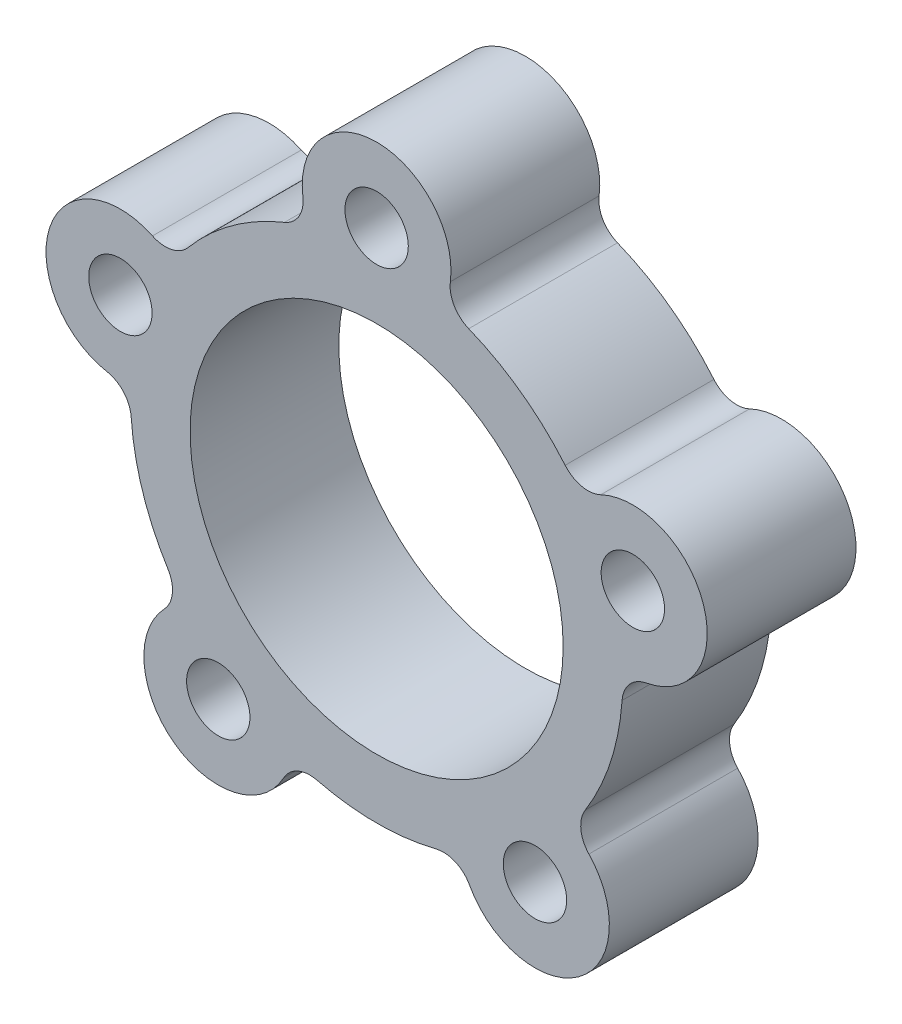
ISO-10303-21;
HEADER;
FILE_DESCRIPTION(('STEP AP214'),'2;1');
FILE_NAME('part.step','',(''),(''),'','','');
FILE_SCHEMA(('AUTOMOTIVE_DESIGN { 1 0 10303 214 1 1 1 1 }'));
ENDSEC;
DATA;
#1=APPLICATION_CONTEXT('core data for automotive mechanical design processes');
#2=APPLICATION_PROTOCOL_DEFINITION('international standard','automotive_design',2000,#1);
#3=PRODUCT_CONTEXT('',#1,'mechanical');
#4=PRODUCT('Part','Part','',(#3));
#5=PRODUCT_RELATED_PRODUCT_CATEGORY('part','',(#4));
#6=PRODUCT_DEFINITION_FORMATION('','',#4);
#7=PRODUCT_DEFINITION_CONTEXT('part definition',#1,'design');
#8=PRODUCT_DEFINITION('design','',#6,#7);
#9=PRODUCT_DEFINITION_SHAPE('','',#8);
#10=(LENGTH_UNIT() NAMED_UNIT(*) SI_UNIT(.MILLI.,.METRE.));
#11=(NAMED_UNIT(*) PLANE_ANGLE_UNIT() SI_UNIT($,.RADIAN.));
#12=(NAMED_UNIT(*) SI_UNIT($,.STERADIAN.) SOLID_ANGLE_UNIT());
#13=UNCERTAINTY_MEASURE_WITH_UNIT(LENGTH_MEASURE(1.E-05),#10,'distance_accuracy_value','');
#14=(GEOMETRIC_REPRESENTATION_CONTEXT(3) GLOBAL_UNCERTAINTY_ASSIGNED_CONTEXT((#13)) GLOBAL_UNIT_ASSIGNED_CONTEXT((#10,
#11,#12)) REPRESENTATION_CONTEXT('',''));
#15=CARTESIAN_POINT('',(0.,0.,0.));
#16=DIRECTION('',(0.,0.,1.));
#17=DIRECTION('',(1.,0.,0.));
#18=AXIS2_PLACEMENT_3D('',#15,#16,#17);
#19=CARTESIAN_POINT('',(2.20330688721567,5.45854672630436,16.51));
#20=DIRECTION('',(0.,0.,1.));
#21=DIRECTION('',(1.,0.,0.));
#22=AXIS2_PLACEMENT_3D('',#19,#20,#21);
#23=PLANE('',#22);
#24=CARTESIAN_POINT('',(-10.9371499373943,3.55369543531211,16.51));
#25=DIRECTION('',(0.,0.,1.));
#26=DIRECTION('',(1.,0.,0.));
#27=AXIS2_PLACEMENT_3D('',#24,#25,#26);
#28=CIRCLE('',#27,1.35255);
#29=CARTESIAN_POINT('',(-9.58459993739428,3.55369543531211,16.51));
#30=VERTEX_POINT('',#29);
#31=EDGE_CURVE('E414',#30,#30,#28,.T.);
#32=ORIENTED_EDGE('',*,*,#31,.F.);
#33=EDGE_LOOP('',(#32));
#34=FACE_BOUND('',#33,.T.);
#35=CARTESIAN_POINT('',(0.,11.5000000000002,16.51));
#36=DIRECTION('',(0.,0.,1.));
#37=DIRECTION('',(1.,0.,0.));
#38=AXIS2_PLACEMENT_3D('',#35,#36,#37);
#39=CIRCLE('',#38,1.35255);
#40=CARTESIAN_POINT('',(1.35255,11.5000000000002,16.51));
#41=VERTEX_POINT('',#40);
#42=EDGE_CURVE('E416',#41,#41,#39,.T.);
#43=ORIENTED_EDGE('',*,*,#42,.F.);
#44=EDGE_LOOP('',(#43));
#45=FACE_BOUND('',#44,.T.);
#46=CARTESIAN_POINT('',(10.9371499373942,3.55369543531226,16.51));
#47=DIRECTION('',(0.,0.,1.));
#48=DIRECTION('',(1.,0.,0.));
#49=AXIS2_PLACEMENT_3D('',#46,#47,#48);
#50=CIRCLE('',#49,1.35255);
#51=CARTESIAN_POINT('',(12.2896999373942,3.55369543531226,16.51));
#52=VERTEX_POINT('',#51);
#53=EDGE_CURVE('E424',#52,#52,#50,.T.);
#54=ORIENTED_EDGE('',*,*,#53,.F.);
#55=EDGE_LOOP('',(#54));
#56=FACE_BOUND('',#55,.T.);
#57=CARTESIAN_POINT('',(6.75953040136352,-9.30369543531159,16.51));
#58=DIRECTION('',(0.,0.,1.));
#59=DIRECTION('',(1.,0.,0.));
#60=AXIS2_PLACEMENT_3D('',#57,#58,#59);
#61=CIRCLE('',#60,1.35255);
#62=CARTESIAN_POINT('',(8.11208040136352,-9.30369543531159,16.51));
#63=VERTEX_POINT('',#62);
#64=EDGE_CURVE('E430',#63,#63,#61,.T.);
#65=ORIENTED_EDGE('',*,*,#64,.F.);
#66=EDGE_LOOP('',(#65));
#67=FACE_BOUND('',#66,.T.);
#68=CARTESIAN_POINT('',(-6.75953040136339,-9.30369543531169,16.51));
#69=DIRECTION('',(0.,0.,1.));
#70=DIRECTION('',(1.,0.,0.));
#71=AXIS2_PLACEMENT_3D('',#68,#69,#70);
#72=CIRCLE('',#71,1.35255);
#73=CARTESIAN_POINT('',(-5.40698040136339,-9.30369543531169,16.51));
#74=VERTEX_POINT('',#73);
#75=EDGE_CURVE('E436',#74,#74,#72,.T.);
#76=ORIENTED_EDGE('',*,*,#75,.F.);
#77=EDGE_LOOP('',(#76));
#78=FACE_BOUND('',#77,.T.);
#79=CARTESIAN_POINT('',(4.40661377443134,10.9170934526087,16.51));
#80=DIRECTION('',(0.,0.,-1.));
#81=DIRECTION('',(1.,0.,0.));
#82=AXIS2_PLACEMENT_3D('',#79,#80,#81);
#83=CIRCLE('',#82,1.27);
#84=CARTESIAN_POINT('',(3.93125090771815,9.73941346850852,16.51));
#85=VERTEX_POINT('',#84);
#86=CARTESIAN_POINT('',(3.14758126745096,11.0836381804349,16.51));
#87=VERTEX_POINT('',#86);
#88=EDGE_CURVE('E257',#85,#87,#83,.T.);
#89=ORIENTED_EDGE('',*,*,#88,.T.);
#90=CARTESIAN_POINT('',(0.,11.5000000000002,16.51));
#91=DIRECTION('',(0.,0.,1.));
#92=DIRECTION('',(1.,0.,0.));
#93=AXIS2_PLACEMENT_3D('',#90,#91,#92);
#94=CIRCLE('',#93,3.175);
#95=CARTESIAN_POINT('',(-3.14758126745096,11.0836381804349,16.51));
#96=VERTEX_POINT('',#95);
#97=EDGE_CURVE('E145',#87,#96,#94,.T.);
#98=ORIENTED_EDGE('',*,*,#97,.T.);
#99=CARTESIAN_POINT('',(-4.40661377443135,10.9170934526087,16.51));
#100=DIRECTION('',(0.,0.,-1.));
#101=DIRECTION('',(1.,0.,0.));
#102=AXIS2_PLACEMENT_3D('',#99,#100,#101);
#103=CIRCLE('',#102,1.27);
#104=CARTESIAN_POINT('',(-3.93125090771815,9.73941346850853,16.51));
#105=VERTEX_POINT('',#104);
#106=EDGE_CURVE('E308',#96,#105,#103,.T.);
#107=ORIENTED_EDGE('',*,*,#106,.T.);
#108=CARTESIAN_POINT('',(0.,0.,16.51));
#109=DIRECTION('',(0.,0.,1.));
#110=DIRECTION('',(1.,0.,0.));
#111=AXIS2_PLACEMENT_3D('',#108,#109,#110);
#112=CIRCLE('',#111,10.5029);
#113=CARTESIAN_POINT('',(-8.04790930448084,6.74848606999012,16.51));
#114=VERTEX_POINT('',#113);
#115=EDGE_CURVE('E327',#105,#114,#112,.T.);
#116=ORIENTED_EDGE('',*,*,#115,.T.);
#117=CARTESIAN_POINT('',(-9.02105432316051,7.56450615100465,16.51));
#118=DIRECTION('',(0.,0.,-1.));
#119=DIRECTION('',(1.,0.,0.));
#120=AXIS2_PLACEMENT_3D('',#117,#118,#119);
#121=CIRCLE('',#120,1.27);
#122=CARTESIAN_POINT('',(-9.56851021294159,6.41856023223535,16.51));
#123=VERTEX_POINT('',#122);
#124=EDGE_CURVE('E324',#114,#123,#121,.T.);
#125=ORIENTED_EDGE('',*,*,#124,.T.);
#126=CARTESIAN_POINT('',(-10.9371499373943,3.55369543531211,16.51));
#127=DIRECTION('',(0.,0.,1.));
#128=DIRECTION('',(1.,0.,0.));
#129=AXIS2_PLACEMENT_3D('',#126,#127,#128);
#130=CIRCLE('',#129,3.175);
#131=CARTESIAN_POINT('',(-11.5138224185789,0.431504882279766,16.51));
#132=VERTEX_POINT('',#131);
#133=EDGE_CURVE('E326',#123,#132,#130,.T.);
#134=ORIENTED_EDGE('',*,*,#133,.T.);
#135=CARTESIAN_POINT('',(-11.7444914110527,-0.817371338933172,16.51));
#136=DIRECTION('',(0.,0.,-1.));
#137=DIRECTION('',(1.,0.,0.));
#138=AXIS2_PLACEMENT_3D('',#135,#136,#137);
#139=CIRCLE('',#138,1.27);
#140=CARTESIAN_POINT('',(-10.4775559837547,-0.729197515963035,16.51));
#141=VERTEX_POINT('',#140);
#142=EDGE_CURVE('E329',#132,#141,#139,.T.);
#143=ORIENTED_EDGE('',*,*,#142,.T.);
#144=CARTESIAN_POINT('',(0.,0.,16.51));
#145=DIRECTION('',(0.,0.,1.));
#146=DIRECTION('',(1.,0.,0.));
#147=AXIS2_PLACEMENT_3D('',#144,#145,#146);
#148=CIRCLE('',#147,10.5029);
#149=CARTESIAN_POINT('',(-8.90513239626398,-5.56861970464942,16.51));
#150=VERTEX_POINT('',#149);
#151=EDGE_CURVE('E335',#141,#150,#148,.T.);
#152=ORIENTED_EDGE('',*,*,#151,.T.);
#153=CARTESIAN_POINT('',(-9.98193196050388,-6.24197154318018,16.51));
#154=DIRECTION('',(0.,0.,-1.));
#155=DIRECTION('',(1.,0.,0.));
#156=AXIS2_PLACEMENT_3D('',#153,#154,#155);
#157=CIRCLE('',#156,1.27);
#158=CARTESIAN_POINT('',(-9.06124580074946,-7.1167497980749,16.51));
#159=VERTEX_POINT('',#158);
#160=EDGE_CURVE('E337',#150,#159,#157,.T.);
#161=ORIENTED_EDGE('',*,*,#160,.T.);
#162=CARTESIAN_POINT('',(-6.75953040136339,-9.30369543531169,16.51));
#163=DIRECTION('',(0.,0.,1.));
#164=DIRECTION('',(1.,0.,0.));
#165=AXIS2_PLACEMENT_3D('',#162,#163,#164);
#166=CIRCLE('',#165,3.175);
#167=CARTESIAN_POINT('',(-3.96835232766129,-10.8169534968744,16.51));
#168=VERTEX_POINT('',#167);
#169=EDGE_CURVE('E339',#159,#168,#166,.T.);
#170=ORIENTED_EDGE('',*,*,#169,.T.);
#171=CARTESIAN_POINT('',(-2.85188109818045,-11.4222567214995,16.51));
#172=DIRECTION('',(0.,0.,-1.));
#173=DIRECTION('',(1.,0.,0.));
#174=AXIS2_PLACEMENT_3D('',#171,#172,#173);
#175=CIRCLE('',#174,1.27);
#176=CARTESIAN_POINT('',(-2.54423480927209,-10.1900823178858,16.51));
#177=VERTEX_POINT('',#176);
#178=EDGE_CURVE('E341',#168,#177,#175,.T.);
#179=ORIENTED_EDGE('',*,*,#178,.T.);
#180=CARTESIAN_POINT('',(0.,0.,16.51));
#181=DIRECTION('',(0.,0.,1.));
#182=DIRECTION('',(1.,0.,0.));
#183=AXIS2_PLACEMENT_3D('',#180,#181,#182);
#184=CIRCLE('',#183,10.5029);
#185=CARTESIAN_POINT('',(2.54423480927224,-10.1900823178857,16.51));
#186=VERTEX_POINT('',#185);
#187=EDGE_CURVE('E343',#177,#186,#184,.T.);
#188=ORIENTED_EDGE('',*,*,#187,.T.);
#189=CARTESIAN_POINT('',(2.85188109818061,-11.4222567214995,16.51));
#190=DIRECTION('',(0.,0.,-1.));
#191=DIRECTION('',(1.,0.,0.));
#192=AXIS2_PLACEMENT_3D('',#189,#190,#191);
#193=CIRCLE('',#192,1.27);
#194=CARTESIAN_POINT('',(3.96835232766145,-10.8169534968744,16.51));
#195=VERTEX_POINT('',#194);
#196=EDGE_CURVE('E345',#186,#195,#193,.T.);
#197=ORIENTED_EDGE('',*,*,#196,.T.);
#198=CARTESIAN_POINT('',(6.75953040136352,-9.30369543531159,16.51));
#199=DIRECTION('',(0.,0.,1.));
#200=DIRECTION('',(1.,0.,0.));
#201=AXIS2_PLACEMENT_3D('',#198,#199,#200);
#202=CIRCLE('',#201,3.175);
#203=CARTESIAN_POINT('',(9.06124580074956,-7.11674979807477,16.51));
#204=VERTEX_POINT('',#203);
#205=EDGE_CURVE('E347',#195,#204,#202,.T.);
#206=ORIENTED_EDGE('',*,*,#205,.T.);
#207=CARTESIAN_POINT('',(9.98193196050397,-6.24197154318004,16.51));
#208=DIRECTION('',(0.,0.,-1.));
#209=DIRECTION('',(1.,0.,0.));
#210=AXIS2_PLACEMENT_3D('',#207,#208,#209);
#211=CIRCLE('',#210,1.27);
#212=CARTESIAN_POINT('',(8.90513239626406,-5.56861970464929,16.51));
#213=VERTEX_POINT('',#212);
#214=EDGE_CURVE('E349',#204,#213,#211,.T.);
#215=ORIENTED_EDGE('',*,*,#214,.T.);
#216=CARTESIAN_POINT('',(0.,0.,16.51));
#217=DIRECTION('',(0.,0.,1.));
#218=DIRECTION('',(1.,0.,0.));
#219=AXIS2_PLACEMENT_3D('',#216,#217,#218);
#220=CIRCLE('',#219,10.5029);
#221=CARTESIAN_POINT('',(10.4775559837547,-0.72919751596289,16.51));
#222=VERTEX_POINT('',#221);
#223=EDGE_CURVE('E351',#213,#222,#220,.T.);
#224=ORIENTED_EDGE('',*,*,#223,.T.);
#225=CARTESIAN_POINT('',(11.7444914110527,-0.817371338933004,16.51));
#226=DIRECTION('',(0.,0.,-1.));
#227=DIRECTION('',(1.,0.,0.));
#228=AXIS2_PLACEMENT_3D('',#225,#226,#227);
#229=CIRCLE('',#228,1.27);
#230=CARTESIAN_POINT('',(11.5138224185789,0.431504882279929,16.51));
#231=VERTEX_POINT('',#230);
#232=EDGE_CURVE('E200',#222,#231,#229,.T.);
#233=ORIENTED_EDGE('',*,*,#232,.T.);
#234=CARTESIAN_POINT('',(10.9371499373942,3.55369543531226,16.51));
#235=DIRECTION('',(0.,0.,1.));
#236=DIRECTION('',(1.,0.,0.));
#237=AXIS2_PLACEMENT_3D('',#234,#235,#236);
#238=CIRCLE('',#237,3.175);
#239=CARTESIAN_POINT('',(9.56851021294149,6.41856023223549,16.51));
#240=VERTEX_POINT('',#239);
#241=EDGE_CURVE('E194',#231,#240,#238,.T.);
#242=ORIENTED_EDGE('',*,*,#241,.T.);
#243=CARTESIAN_POINT('',(9.0210543231604,7.56450615100478,16.51));
#244=DIRECTION('',(0.,0.,-1.));
#245=DIRECTION('',(1.,0.,0.));
#246=AXIS2_PLACEMENT_3D('',#243,#244,#245);
#247=CIRCLE('',#246,1.27);
#248=CARTESIAN_POINT('',(8.04790930448074,6.74848606999024,16.51));
#249=VERTEX_POINT('',#248);
#250=EDGE_CURVE('E198',#240,#249,#247,.T.);
#251=ORIENTED_EDGE('',*,*,#250,.T.);
#252=CARTESIAN_POINT('',(0.,0.,16.51));
#253=DIRECTION('',(0.,0.,1.));
#254=DIRECTION('',(1.,0.,0.));
#255=AXIS2_PLACEMENT_3D('',#252,#253,#254);
#256=CIRCLE('',#255,10.5029);
#257=EDGE_CURVE('E66',#249,#85,#256,.T.);
#258=ORIENTED_EDGE('',*,*,#257,.T.);
#259=EDGE_LOOP('',(#89,#98,#107,#116,#125,#134,#143,#152,#161,#170,#179,#188,#197,#206,#215,
#224,#233,#242,#251,#258));
#260=FACE_BOUND('',#259,.T.);
#261=CARTESIAN_POINT('',(0.,0.,16.51));
#262=DIRECTION('',(0.,0.,1.));
#263=DIRECTION('',(1.,0.,0.));
#264=AXIS2_PLACEMENT_3D('',#261,#262,#263);
#265=CIRCLE('',#264,7.9629);
#266=CARTESIAN_POINT('',(7.9629,0.,16.51));
#267=VERTEX_POINT('',#266);
#268=EDGE_CURVE('E222',#267,#267,#265,.T.);
#269=ORIENTED_EDGE('',*,*,#268,.F.);
#270=EDGE_LOOP('',(#269));
#271=FACE_BOUND('',#270,.T.);
#272=ADVANCED_FACE('F49',(#34,#45,#56,#67,#78,#260,#271),#23,.T.);
#273=CARTESIAN_POINT('',(2.20330688721567,5.45854672630436,10.16));
#274=DIRECTION('',(0.,0.,1.));
#275=DIRECTION('',(1.,0.,0.));
#276=AXIS2_PLACEMENT_3D('',#273,#274,#275);
#277=PLANE('',#276);
#278=CARTESIAN_POINT('',(-10.9371499373943,3.55369543531211,10.16));
#279=DIRECTION('',(0.,0.,1.));
#280=DIRECTION('',(1.,0.,0.));
#281=AXIS2_PLACEMENT_3D('',#278,#279,#280);
#282=CIRCLE('',#281,1.35255);
#283=CARTESIAN_POINT('',(-9.58459993739428,3.55369543531211,10.16));
#284=VERTEX_POINT('',#283);
#285=EDGE_CURVE('E412',#284,#284,#282,.T.);
#286=ORIENTED_EDGE('',*,*,#285,.T.);
#287=EDGE_LOOP('',(#286));
#288=FACE_BOUND('',#287,.T.);
#289=CARTESIAN_POINT('',(0.,11.5000000000002,10.16));
#290=DIRECTION('',(0.,0.,1.));
#291=DIRECTION('',(1.,0.,0.));
#292=AXIS2_PLACEMENT_3D('',#289,#290,#291);
#293=CIRCLE('',#292,1.35255);
#294=CARTESIAN_POINT('',(1.35255,11.5000000000002,10.16));
#295=VERTEX_POINT('',#294);
#296=EDGE_CURVE('E421',#295,#295,#293,.T.);
#297=ORIENTED_EDGE('',*,*,#296,.T.);
#298=EDGE_LOOP('',(#297));
#299=FACE_BOUND('',#298,.T.);
#300=CARTESIAN_POINT('',(10.9371499373942,3.55369543531226,10.16));
#301=DIRECTION('',(0.,0.,1.));
#302=DIRECTION('',(1.,0.,0.));
#303=AXIS2_PLACEMENT_3D('',#300,#301,#302);
#304=CIRCLE('',#303,1.35255);
#305=CARTESIAN_POINT('',(12.2896999373942,3.55369543531226,10.16));
#306=VERTEX_POINT('',#305);
#307=EDGE_CURVE('E427',#306,#306,#304,.T.);
#308=ORIENTED_EDGE('',*,*,#307,.T.);
#309=EDGE_LOOP('',(#308));
#310=FACE_BOUND('',#309,.T.);
#311=CARTESIAN_POINT('',(6.75953040136352,-9.30369543531159,10.16));
#312=DIRECTION('',(0.,0.,1.));
#313=DIRECTION('',(1.,0.,0.));
#314=AXIS2_PLACEMENT_3D('',#311,#312,#313);
#315=CIRCLE('',#314,1.35255);
#316=CARTESIAN_POINT('',(8.11208040136352,-9.30369543531159,10.16));
#317=VERTEX_POINT('',#316);
#318=EDGE_CURVE('E433',#317,#317,#315,.T.);
#319=ORIENTED_EDGE('',*,*,#318,.T.);
#320=EDGE_LOOP('',(#319));
#321=FACE_BOUND('',#320,.T.);
#322=CARTESIAN_POINT('',(-6.75953040136339,-9.30369543531169,10.16));
#323=DIRECTION('',(0.,0.,1.));
#324=DIRECTION('',(1.,0.,0.));
#325=AXIS2_PLACEMENT_3D('',#322,#323,#324);
#326=CIRCLE('',#325,1.35255);
#327=CARTESIAN_POINT('',(-5.40698040136339,-9.30369543531169,10.16));
#328=VERTEX_POINT('',#327);
#329=EDGE_CURVE('E439',#328,#328,#326,.T.);
#330=ORIENTED_EDGE('',*,*,#329,.T.);
#331=EDGE_LOOP('',(#330));
#332=FACE_BOUND('',#331,.T.);
#333=CARTESIAN_POINT('',(4.40661377443134,10.9170934526087,10.16));
#334=DIRECTION('',(0.,0.,-1.));
#335=DIRECTION('',(1.,0.,0.));
#336=AXIS2_PLACEMENT_3D('',#333,#334,#335);
#337=CIRCLE('',#336,1.27);
#338=CARTESIAN_POINT('',(3.93125090771815,9.73941346850852,10.16));
#339=VERTEX_POINT('',#338);
#340=CARTESIAN_POINT('',(3.14758126745096,11.0836381804349,10.16));
#341=VERTEX_POINT('',#340);
#342=EDGE_CURVE('E218',#339,#341,#337,.T.);
#343=ORIENTED_EDGE('',*,*,#342,.F.);
#344=CARTESIAN_POINT('',(0.,0.,10.16));
#345=DIRECTION('',(0.,0.,1.));
#346=DIRECTION('',(1.,0.,0.));
#347=AXIS2_PLACEMENT_3D('',#344,#345,#346);
#348=CIRCLE('',#347,10.5029);
#349=CARTESIAN_POINT('',(8.04790930448074,6.74848606999024,10.16));
#350=VERTEX_POINT('',#349);
#351=EDGE_CURVE('E137',#350,#339,#348,.T.);
#352=ORIENTED_EDGE('',*,*,#351,.F.);
#353=CARTESIAN_POINT('',(9.0210543231604,7.56450615100478,10.16));
#354=DIRECTION('',(0.,0.,-1.));
#355=DIRECTION('',(1.,0.,0.));
#356=AXIS2_PLACEMENT_3D('',#353,#354,#355);
#357=CIRCLE('',#356,1.27);
#358=CARTESIAN_POINT('',(9.56851021294149,6.41856023223549,10.16));
#359=VERTEX_POINT('',#358);
#360=EDGE_CURVE('E131',#359,#350,#357,.T.);
#361=ORIENTED_EDGE('',*,*,#360,.F.);
#362=CARTESIAN_POINT('',(10.9371499373942,3.55369543531226,10.16));
#363=DIRECTION('',(0.,0.,1.));
#364=DIRECTION('',(1.,0.,0.));
#365=AXIS2_PLACEMENT_3D('',#362,#363,#364);
#366=CIRCLE('',#365,3.175);
#367=CARTESIAN_POINT('',(11.5138224185789,0.431504882279929,10.16));
#368=VERTEX_POINT('',#367);
#369=EDGE_CURVE('E208',#368,#359,#366,.T.);
#370=ORIENTED_EDGE('',*,*,#369,.F.);
#371=CARTESIAN_POINT('',(11.7444914110527,-0.817371338933004,10.16));
#372=DIRECTION('',(0.,0.,-1.));
#373=DIRECTION('',(1.,0.,0.));
#374=AXIS2_PLACEMENT_3D('',#371,#372,#373);
#375=CIRCLE('',#374,1.27);
#376=CARTESIAN_POINT('',(10.4775559837547,-0.72919751596289,10.16));
#377=VERTEX_POINT('',#376);
#378=EDGE_CURVE('E252',#377,#368,#375,.T.);
#379=ORIENTED_EDGE('',*,*,#378,.F.);
#380=CARTESIAN_POINT('',(0.,0.,10.16));
#381=DIRECTION('',(0.,0.,1.));
#382=DIRECTION('',(1.,0.,0.));
#383=AXIS2_PLACEMENT_3D('',#380,#381,#382);
#384=CIRCLE('',#383,10.5029);
#385=CARTESIAN_POINT('',(8.90513239626406,-5.56861970464929,10.16));
#386=VERTEX_POINT('',#385);
#387=EDGE_CURVE('E250',#386,#377,#384,.T.);
#388=ORIENTED_EDGE('',*,*,#387,.F.);
#389=CARTESIAN_POINT('',(9.98193196050397,-6.24197154318004,10.16));
#390=DIRECTION('',(0.,0.,-1.));
#391=DIRECTION('',(1.,0.,0.));
#392=AXIS2_PLACEMENT_3D('',#389,#390,#391);
#393=CIRCLE('',#392,1.27);
#394=CARTESIAN_POINT('',(9.06124580074956,-7.11674979807477,10.16));
#395=VERTEX_POINT('',#394);
#396=EDGE_CURVE('E248',#395,#386,#393,.T.);
#397=ORIENTED_EDGE('',*,*,#396,.F.);
#398=CARTESIAN_POINT('',(6.75953040136352,-9.30369543531159,10.16));
#399=DIRECTION('',(0.,0.,1.));
#400=DIRECTION('',(1.,0.,0.));
#401=AXIS2_PLACEMENT_3D('',#398,#399,#400);
#402=CIRCLE('',#401,3.175);
#403=CARTESIAN_POINT('',(3.96835232766145,-10.8169534968744,10.16));
#404=VERTEX_POINT('',#403);
#405=EDGE_CURVE('E246',#404,#395,#402,.T.);
#406=ORIENTED_EDGE('',*,*,#405,.F.);
#407=CARTESIAN_POINT('',(2.85188109818061,-11.4222567214995,10.16));
#408=DIRECTION('',(0.,0.,-1.));
#409=DIRECTION('',(1.,0.,0.));
#410=AXIS2_PLACEMENT_3D('',#407,#408,#409);
#411=CIRCLE('',#410,1.27);
#412=CARTESIAN_POINT('',(2.54423480927224,-10.1900823178857,10.16));
#413=VERTEX_POINT('',#412);
#414=EDGE_CURVE('E244',#413,#404,#411,.T.);
#415=ORIENTED_EDGE('',*,*,#414,.F.);
#416=CARTESIAN_POINT('',(0.,0.,10.16));
#417=DIRECTION('',(0.,0.,1.));
#418=DIRECTION('',(1.,0.,0.));
#419=AXIS2_PLACEMENT_3D('',#416,#417,#418);
#420=CIRCLE('',#419,10.5029);
#421=CARTESIAN_POINT('',(-2.54423480927209,-10.1900823178858,10.16));
#422=VERTEX_POINT('',#421);
#423=EDGE_CURVE('E242',#422,#413,#420,.T.);
#424=ORIENTED_EDGE('',*,*,#423,.F.);
#425=CARTESIAN_POINT('',(-2.85188109818045,-11.4222567214995,10.16));
#426=DIRECTION('',(0.,0.,-1.));
#427=DIRECTION('',(1.,0.,0.));
#428=AXIS2_PLACEMENT_3D('',#425,#426,#427);
#429=CIRCLE('',#428,1.27);
#430=CARTESIAN_POINT('',(-3.96835232766129,-10.8169534968744,10.16));
#431=VERTEX_POINT('',#430);
#432=EDGE_CURVE('E240',#431,#422,#429,.T.);
#433=ORIENTED_EDGE('',*,*,#432,.F.);
#434=CARTESIAN_POINT('',(-6.75953040136339,-9.30369543531169,10.16));
#435=DIRECTION('',(0.,0.,1.));
#436=DIRECTION('',(1.,0.,0.));
#437=AXIS2_PLACEMENT_3D('',#434,#435,#436);
#438=CIRCLE('',#437,3.175);
#439=CARTESIAN_POINT('',(-9.06124580074946,-7.1167497980749,10.16));
#440=VERTEX_POINT('',#439);
#441=EDGE_CURVE('E238',#440,#431,#438,.T.);
#442=ORIENTED_EDGE('',*,*,#441,.F.);
#443=CARTESIAN_POINT('',(-9.98193196050388,-6.24197154318018,10.16));
#444=DIRECTION('',(0.,0.,-1.));
#445=DIRECTION('',(1.,0.,0.));
#446=AXIS2_PLACEMENT_3D('',#443,#444,#445);
#447=CIRCLE('',#446,1.27);
#448=CARTESIAN_POINT('',(-8.90513239626398,-5.56861970464942,10.16));
#449=VERTEX_POINT('',#448);
#450=EDGE_CURVE('E236',#449,#440,#447,.T.);
#451=ORIENTED_EDGE('',*,*,#450,.F.);
#452=CARTESIAN_POINT('',(0.,0.,10.16));
#453=DIRECTION('',(0.,0.,1.));
#454=DIRECTION('',(1.,0.,0.));
#455=AXIS2_PLACEMENT_3D('',#452,#453,#454);
#456=CIRCLE('',#455,10.5029);
#457=CARTESIAN_POINT('',(-10.4775559837547,-0.729197515963035,10.16));
#458=VERTEX_POINT('',#457);
#459=EDGE_CURVE('E234',#458,#449,#456,.T.);
#460=ORIENTED_EDGE('',*,*,#459,.F.);
#461=CARTESIAN_POINT('',(-11.7444914110527,-0.817371338933172,10.16));
#462=DIRECTION('',(0.,0.,-1.));
#463=DIRECTION('',(1.,0.,0.));
#464=AXIS2_PLACEMENT_3D('',#461,#462,#463);
#465=CIRCLE('',#464,1.27);
#466=CARTESIAN_POINT('',(-11.5138224185789,0.431504882279766,10.16));
#467=VERTEX_POINT('',#466);
#468=EDGE_CURVE('E232',#467,#458,#465,.T.);
#469=ORIENTED_EDGE('',*,*,#468,.F.);
#470=CARTESIAN_POINT('',(-10.9371499373943,3.55369543531211,10.16));
#471=DIRECTION('',(0.,0.,1.));
#472=DIRECTION('',(1.,0.,0.));
#473=AXIS2_PLACEMENT_3D('',#470,#471,#472);
#474=CIRCLE('',#473,3.175);
#475=CARTESIAN_POINT('',(-9.56851021294159,6.41856023223535,10.16));
#476=VERTEX_POINT('',#475);
#477=EDGE_CURVE('E230',#476,#467,#474,.T.);
#478=ORIENTED_EDGE('',*,*,#477,.F.);
#479=CARTESIAN_POINT('',(-9.02105432316051,7.56450615100465,10.16));
#480=DIRECTION('',(0.,0.,-1.));
#481=DIRECTION('',(1.,0.,0.));
#482=AXIS2_PLACEMENT_3D('',#479,#480,#481);
#483=CIRCLE('',#482,1.27);
#484=CARTESIAN_POINT('',(-8.04790930448084,6.74848606999012,10.16));
#485=VERTEX_POINT('',#484);
#486=EDGE_CURVE('E228',#485,#476,#483,.T.);
#487=ORIENTED_EDGE('',*,*,#486,.F.);
#488=CARTESIAN_POINT('',(0.,0.,10.16));
#489=DIRECTION('',(0.,0.,1.));
#490=DIRECTION('',(1.,0.,0.));
#491=AXIS2_PLACEMENT_3D('',#488,#489,#490);
#492=CIRCLE('',#491,10.5029);
#493=CARTESIAN_POINT('',(-3.93125090771815,9.73941346850853,10.16));
#494=VERTEX_POINT('',#493);
#495=EDGE_CURVE('E226',#494,#485,#492,.T.);
#496=ORIENTED_EDGE('',*,*,#495,.F.);
#497=CARTESIAN_POINT('',(-4.40661377443135,10.9170934526087,10.16));
#498=DIRECTION('',(0.,0.,-1.));
#499=DIRECTION('',(1.,0.,0.));
#500=AXIS2_PLACEMENT_3D('',#497,#498,#499);
#501=CIRCLE('',#500,1.27);
#502=CARTESIAN_POINT('',(-3.14758126745096,11.0836381804349,10.16));
#503=VERTEX_POINT('',#502);
#504=EDGE_CURVE('E224',#503,#494,#501,.T.);
#505=ORIENTED_EDGE('',*,*,#504,.F.);
#506=CARTESIAN_POINT('',(0.,11.5000000000002,10.16));
#507=DIRECTION('',(0.,0.,1.));
#508=DIRECTION('',(1.,0.,0.));
#509=AXIS2_PLACEMENT_3D('',#506,#507,#508);
#510=CIRCLE('',#509,3.175);
#511=EDGE_CURVE('E221',#341,#503,#510,.T.);
#512=ORIENTED_EDGE('',*,*,#511,.F.);
#513=EDGE_LOOP('',(#343,#352,#361,#370,#379,#388,#397,#406,#415,#424,#433,#442,#451,#460,#469,
#478,#487,#496,#505,#512));
#514=FACE_BOUND('',#513,.T.);
#515=CARTESIAN_POINT('',(0.,0.,10.16));
#516=DIRECTION('',(0.,0.,1.));
#517=DIRECTION('',(1.,0.,0.));
#518=AXIS2_PLACEMENT_3D('',#515,#516,#517);
#519=CIRCLE('',#518,7.9629);
#520=CARTESIAN_POINT('',(7.9629,0.,10.16));
#521=VERTEX_POINT('',#520);
#522=EDGE_CURVE('E442',#521,#521,#519,.T.);
#523=ORIENTED_EDGE('',*,*,#522,.T.);
#524=EDGE_LOOP('',(#523));
#525=FACE_BOUND('',#524,.T.);
#526=ADVANCED_FACE('F312',(#288,#299,#310,#321,#332,#514,#525),#277,.F.);
#527=CARTESIAN_POINT('',(4.40661377443134,10.9170934526087,16.51));
#528=DIRECTION('',(0.,0.,-1.));
#529=DIRECTION('',(-1.,0.,0.));
#530=AXIS2_PLACEMENT_3D('',#527,#528,#529);
#531=CYLINDRICAL_SURFACE('',#530,1.27);
#532=ORIENTED_EDGE('',*,*,#342,.T.);
#533=DIRECTION('',(0.,0.,-1.));
#534=VECTOR('',#533,1.);
#535=CARTESIAN_POINT('',(3.14758126745096,11.0836381804349,16.51));
#536=LINE('',#535,#534);
#537=EDGE_CURVE('E11',#87,#341,#536,.T.);
#538=ORIENTED_EDGE('',*,*,#537,.F.);
#539=ORIENTED_EDGE('',*,*,#88,.F.);
#540=DIRECTION('',(0.,0.,-1.));
#541=VECTOR('',#540,1.);
#542=CARTESIAN_POINT('',(3.93125090771815,9.73941346850852,16.51));
#543=LINE('',#542,#541);
#544=EDGE_CURVE('E214',#85,#339,#543,.T.);
#545=ORIENTED_EDGE('',*,*,#544,.T.);
#546=EDGE_LOOP('',(#532,#538,#539,#545));
#547=FACE_BOUND('',#546,.T.);
#548=ADVANCED_FACE('F51',(#547),#531,.F.);
#549=CARTESIAN_POINT('',(0.,11.5000000000002,16.51));
#550=DIRECTION('',(0.,0.,-1.));
#551=DIRECTION('',(-1.,0.,0.));
#552=AXIS2_PLACEMENT_3D('',#549,#550,#551);
#553=CYLINDRICAL_SURFACE('',#552,3.175);
#554=ORIENTED_EDGE('',*,*,#511,.T.);
#555=DIRECTION('',(0.,0.,-1.));
#556=VECTOR('',#555,1.);
#557=CARTESIAN_POINT('',(-3.14758126745096,11.0836381804349,16.51));
#558=LINE('',#557,#556);
#559=EDGE_CURVE('E58',#96,#503,#558,.T.);
#560=ORIENTED_EDGE('',*,*,#559,.F.);
#561=ORIENTED_EDGE('',*,*,#97,.F.);
#562=ORIENTED_EDGE('',*,*,#537,.T.);
#563=EDGE_LOOP('',(#554,#560,#561,#562));
#564=FACE_BOUND('',#563,.T.);
#565=ADVANCED_FACE('F709',(#564),#553,.T.);
#566=CARTESIAN_POINT('',(-4.40661377443135,10.9170934526087,16.51));
#567=DIRECTION('',(0.,0.,-1.));
#568=DIRECTION('',(-1.,0.,0.));
#569=AXIS2_PLACEMENT_3D('',#566,#567,#568);
#570=CYLINDRICAL_SURFACE('',#569,1.27);
#571=ORIENTED_EDGE('',*,*,#504,.T.);
#572=DIRECTION('',(0.,0.,-1.));
#573=VECTOR('',#572,1.);
#574=CARTESIAN_POINT('',(-3.93125090771815,9.73941346850853,16.51));
#575=LINE('',#574,#573);
#576=EDGE_CURVE('E300',#105,#494,#575,.T.);
#577=ORIENTED_EDGE('',*,*,#576,.F.);
#578=ORIENTED_EDGE('',*,*,#106,.F.);
#579=ORIENTED_EDGE('',*,*,#559,.T.);
#580=EDGE_LOOP('',(#571,#577,#578,#579));
#581=FACE_BOUND('',#580,.T.);
#582=ADVANCED_FACE('F306',(#581),#570,.F.);
#583=CARTESIAN_POINT('',(0.,0.,16.51));
#584=DIRECTION('',(0.,0.,-1.));
#585=DIRECTION('',(-1.,0.,0.));
#586=AXIS2_PLACEMENT_3D('',#583,#584,#585);
#587=CYLINDRICAL_SURFACE('',#586,10.5029);
#588=ORIENTED_EDGE('',*,*,#495,.T.);
#589=DIRECTION('',(0.,0.,-1.));
#590=VECTOR('',#589,1.);
#591=CARTESIAN_POINT('',(-8.04790930448084,6.74848606999012,16.51));
#592=LINE('',#591,#590);
#593=EDGE_CURVE('E297',#114,#485,#592,.T.);
#594=ORIENTED_EDGE('',*,*,#593,.F.);
#595=ORIENTED_EDGE('',*,*,#115,.F.);
#596=ORIENTED_EDGE('',*,*,#576,.T.);
#597=EDGE_LOOP('',(#588,#594,#595,#596));
#598=FACE_BOUND('',#597,.T.);
#599=ADVANCED_FACE('F318',(#598),#587,.T.);
#600=CARTESIAN_POINT('',(-9.02105432316051,7.56450615100465,16.51));
#601=DIRECTION('',(0.,0.,-1.));
#602=DIRECTION('',(-1.,0.,0.));
#603=AXIS2_PLACEMENT_3D('',#600,#601,#602);
#604=CYLINDRICAL_SURFACE('',#603,1.27);
#605=ORIENTED_EDGE('',*,*,#486,.T.);
#606=DIRECTION('',(0.,0.,-1.));
#607=VECTOR('',#606,1.);
#608=CARTESIAN_POINT('',(-9.56851021294159,6.41856023223535,16.51));
#609=LINE('',#608,#607);
#610=EDGE_CURVE('E294',#123,#476,#609,.T.);
#611=ORIENTED_EDGE('',*,*,#610,.F.);
#612=ORIENTED_EDGE('',*,*,#124,.F.);
#613=ORIENTED_EDGE('',*,*,#593,.T.);
#614=EDGE_LOOP('',(#605,#611,#612,#613));
#615=FACE_BOUND('',#614,.T.);
#616=ADVANCED_FACE('F322',(#615),#604,.F.);
#617=CARTESIAN_POINT('',(-10.9371499373943,3.55369543531211,16.51));
#618=DIRECTION('',(0.,0.,-1.));
#619=DIRECTION('',(-1.,0.,0.));
#620=AXIS2_PLACEMENT_3D('',#617,#618,#619);
#621=CYLINDRICAL_SURFACE('',#620,3.175);
#622=ORIENTED_EDGE('',*,*,#477,.T.);
#623=DIRECTION('',(0.,0.,-1.));
#624=VECTOR('',#623,1.);
#625=CARTESIAN_POINT('',(-11.5138224185789,0.431504882279766,16.51));
#626=LINE('',#625,#624);
#627=EDGE_CURVE('E291',#132,#467,#626,.T.);
#628=ORIENTED_EDGE('',*,*,#627,.F.);
#629=ORIENTED_EDGE('',*,*,#133,.F.);
#630=ORIENTED_EDGE('',*,*,#610,.T.);
#631=EDGE_LOOP('',(#622,#628,#629,#630));
#632=FACE_BOUND('',#631,.T.);
#633=ADVANCED_FACE('F674',(#632),#621,.T.);
#634=CARTESIAN_POINT('',(-11.7444914110527,-0.817371338933172,16.51));
#635=DIRECTION('',(0.,0.,-1.));
#636=DIRECTION('',(-1.,0.,0.));
#637=AXIS2_PLACEMENT_3D('',#634,#635,#636);
#638=CYLINDRICAL_SURFACE('',#637,1.27);
#639=ORIENTED_EDGE('',*,*,#468,.T.);
#640=DIRECTION('',(0.,0.,-1.));
#641=VECTOR('',#640,1.);
#642=CARTESIAN_POINT('',(-10.4775559837547,-0.729197515963035,16.51));
#643=LINE('',#642,#641);
#644=EDGE_CURVE('E288',#141,#458,#643,.T.);
#645=ORIENTED_EDGE('',*,*,#644,.F.);
#646=ORIENTED_EDGE('',*,*,#142,.F.);
#647=ORIENTED_EDGE('',*,*,#627,.T.);
#648=EDGE_LOOP('',(#639,#645,#646,#647));
#649=FACE_BOUND('',#648,.T.);
#650=ADVANCED_FACE('F664',(#649),#638,.F.);
#651=CARTESIAN_POINT('',(0.,0.,16.51));
#652=DIRECTION('',(0.,0.,-1.));
#653=DIRECTION('',(-1.,0.,0.));
#654=AXIS2_PLACEMENT_3D('',#651,#652,#653);
#655=CYLINDRICAL_SURFACE('',#654,10.5029);
#656=ORIENTED_EDGE('',*,*,#459,.T.);
#657=DIRECTION('',(0.,0.,-1.));
#658=VECTOR('',#657,1.);
#659=CARTESIAN_POINT('',(-8.90513239626398,-5.56861970464942,16.51));
#660=LINE('',#659,#658);
#661=EDGE_CURVE('E285',#150,#449,#660,.T.);
#662=ORIENTED_EDGE('',*,*,#661,.F.);
#663=ORIENTED_EDGE('',*,*,#151,.F.);
#664=ORIENTED_EDGE('',*,*,#644,.T.);
#665=EDGE_LOOP('',(#656,#662,#663,#664));
#666=FACE_BOUND('',#665,.T.);
#667=ADVANCED_FACE('F654',(#666),#655,.T.);
#668=CARTESIAN_POINT('',(-9.98193196050388,-6.24197154318018,16.51));
#669=DIRECTION('',(0.,0.,-1.));
#670=DIRECTION('',(-1.,0.,0.));
#671=AXIS2_PLACEMENT_3D('',#668,#669,#670);
#672=CYLINDRICAL_SURFACE('',#671,1.27);
#673=ORIENTED_EDGE('',*,*,#450,.T.);
#674=DIRECTION('',(0.,0.,-1.));
#675=VECTOR('',#674,1.);
#676=CARTESIAN_POINT('',(-9.06124580074946,-7.1167497980749,16.51));
#677=LINE('',#676,#675);
#678=EDGE_CURVE('E282',#159,#440,#677,.T.);
#679=ORIENTED_EDGE('',*,*,#678,.F.);
#680=ORIENTED_EDGE('',*,*,#160,.F.);
#681=ORIENTED_EDGE('',*,*,#661,.T.);
#682=EDGE_LOOP('',(#673,#679,#680,#681));
#683=FACE_BOUND('',#682,.T.);
#684=ADVANCED_FACE('F644',(#683),#672,.F.);
#685=CARTESIAN_POINT('',(-6.75953040136339,-9.30369543531169,16.51));
#686=DIRECTION('',(0.,0.,-1.));
#687=DIRECTION('',(-1.,0.,0.));
#688=AXIS2_PLACEMENT_3D('',#685,#686,#687);
#689=CYLINDRICAL_SURFACE('',#688,3.175);
#690=ORIENTED_EDGE('',*,*,#441,.T.);
#691=DIRECTION('',(0.,0.,-1.));
#692=VECTOR('',#691,1.);
#693=CARTESIAN_POINT('',(-3.96835232766129,-10.8169534968744,16.51));
#694=LINE('',#693,#692);
#695=EDGE_CURVE('E279',#168,#431,#694,.T.);
#696=ORIENTED_EDGE('',*,*,#695,.F.);
#697=ORIENTED_EDGE('',*,*,#169,.F.);
#698=ORIENTED_EDGE('',*,*,#678,.T.);
#699=EDGE_LOOP('',(#690,#696,#697,#698));
#700=FACE_BOUND('',#699,.T.);
#701=ADVANCED_FACE('F634',(#700),#689,.T.);
#702=CARTESIAN_POINT('',(-2.85188109818045,-11.4222567214995,16.51));
#703=DIRECTION('',(0.,0.,-1.));
#704=DIRECTION('',(-1.,0.,0.));
#705=AXIS2_PLACEMENT_3D('',#702,#703,#704);
#706=CYLINDRICAL_SURFACE('',#705,1.27);
#707=ORIENTED_EDGE('',*,*,#432,.T.);
#708=DIRECTION('',(0.,0.,-1.));
#709=VECTOR('',#708,1.);
#710=CARTESIAN_POINT('',(-2.54423480927209,-10.1900823178858,16.51));
#711=LINE('',#710,#709);
#712=EDGE_CURVE('E276',#177,#422,#711,.T.);
#713=ORIENTED_EDGE('',*,*,#712,.F.);
#714=ORIENTED_EDGE('',*,*,#178,.F.);
#715=ORIENTED_EDGE('',*,*,#695,.T.);
#716=EDGE_LOOP('',(#707,#713,#714,#715));
#717=FACE_BOUND('',#716,.T.);
#718=ADVANCED_FACE('F624',(#717),#706,.F.);
#719=CARTESIAN_POINT('',(0.,0.,16.51));
#720=DIRECTION('',(0.,0.,-1.));
#721=DIRECTION('',(-1.,0.,0.));
#722=AXIS2_PLACEMENT_3D('',#719,#720,#721);
#723=CYLINDRICAL_SURFACE('',#722,10.5029);
#724=ORIENTED_EDGE('',*,*,#423,.T.);
#725=DIRECTION('',(0.,0.,-1.));
#726=VECTOR('',#725,1.);
#727=CARTESIAN_POINT('',(2.54423480927224,-10.1900823178857,16.51));
#728=LINE('',#727,#726);
#729=EDGE_CURVE('E273',#186,#413,#728,.T.);
#730=ORIENTED_EDGE('',*,*,#729,.F.);
#731=ORIENTED_EDGE('',*,*,#187,.F.);
#732=ORIENTED_EDGE('',*,*,#712,.T.);
#733=EDGE_LOOP('',(#724,#730,#731,#732));
#734=FACE_BOUND('',#733,.T.);
#735=ADVANCED_FACE('F614',(#734),#723,.T.);
#736=CARTESIAN_POINT('',(2.85188109818061,-11.4222567214995,16.51));
#737=DIRECTION('',(0.,0.,-1.));
#738=DIRECTION('',(-1.,0.,0.));
#739=AXIS2_PLACEMENT_3D('',#736,#737,#738);
#740=CYLINDRICAL_SURFACE('',#739,1.27);
#741=ORIENTED_EDGE('',*,*,#414,.T.);
#742=DIRECTION('',(0.,0.,-1.));
#743=VECTOR('',#742,1.);
#744=CARTESIAN_POINT('',(3.96835232766145,-10.8169534968744,16.51));
#745=LINE('',#744,#743);
#746=EDGE_CURVE('E270',#195,#404,#745,.T.);
#747=ORIENTED_EDGE('',*,*,#746,.F.);
#748=ORIENTED_EDGE('',*,*,#196,.F.);
#749=ORIENTED_EDGE('',*,*,#729,.T.);
#750=EDGE_LOOP('',(#741,#747,#748,#749));
#751=FACE_BOUND('',#750,.T.);
#752=ADVANCED_FACE('F604',(#751),#740,.F.);
#753=CARTESIAN_POINT('',(6.75953040136352,-9.30369543531159,16.51));
#754=DIRECTION('',(0.,0.,-1.));
#755=DIRECTION('',(-1.,0.,0.));
#756=AXIS2_PLACEMENT_3D('',#753,#754,#755);
#757=CYLINDRICAL_SURFACE('',#756,3.175);
#758=ORIENTED_EDGE('',*,*,#405,.T.);
#759=DIRECTION('',(0.,0.,-1.));
#760=VECTOR('',#759,1.);
#761=CARTESIAN_POINT('',(9.06124580074956,-7.11674979807477,16.51));
#762=LINE('',#761,#760);
#763=EDGE_CURVE('E267',#204,#395,#762,.T.);
#764=ORIENTED_EDGE('',*,*,#763,.F.);
#765=ORIENTED_EDGE('',*,*,#205,.F.);
#766=ORIENTED_EDGE('',*,*,#746,.T.);
#767=EDGE_LOOP('',(#758,#764,#765,#766));
#768=FACE_BOUND('',#767,.T.);
#769=ADVANCED_FACE('F594',(#768),#757,.T.);
#770=CARTESIAN_POINT('',(9.98193196050397,-6.24197154318004,16.51));
#771=DIRECTION('',(0.,0.,-1.));
#772=DIRECTION('',(-1.,0.,0.));
#773=AXIS2_PLACEMENT_3D('',#770,#771,#772);
#774=CYLINDRICAL_SURFACE('',#773,1.27);
#775=ORIENTED_EDGE('',*,*,#396,.T.);
#776=DIRECTION('',(0.,0.,-1.));
#777=VECTOR('',#776,1.);
#778=CARTESIAN_POINT('',(8.90513239626406,-5.56861970464929,16.51));
#779=LINE('',#778,#777);
#780=EDGE_CURVE('E264',#213,#386,#779,.T.);
#781=ORIENTED_EDGE('',*,*,#780,.F.);
#782=ORIENTED_EDGE('',*,*,#214,.F.);
#783=ORIENTED_EDGE('',*,*,#763,.T.);
#784=EDGE_LOOP('',(#775,#781,#782,#783));
#785=FACE_BOUND('',#784,.T.);
#786=ADVANCED_FACE('F585',(#785),#774,.F.);
#787=CARTESIAN_POINT('',(0.,0.,16.51));
#788=DIRECTION('',(0.,0.,-1.));
#789=DIRECTION('',(-1.,0.,0.));
#790=AXIS2_PLACEMENT_3D('',#787,#788,#789);
#791=CYLINDRICAL_SURFACE('',#790,10.5029);
#792=ORIENTED_EDGE('',*,*,#387,.T.);
#793=DIRECTION('',(0.,0.,-1.));
#794=VECTOR('',#793,1.);
#795=CARTESIAN_POINT('',(10.4775559837547,-0.72919751596289,16.51));
#796=LINE('',#795,#794);
#797=EDGE_CURVE('E261',#222,#377,#796,.T.);
#798=ORIENTED_EDGE('',*,*,#797,.F.);
#799=ORIENTED_EDGE('',*,*,#223,.F.);
#800=ORIENTED_EDGE('',*,*,#780,.T.);
#801=EDGE_LOOP('',(#792,#798,#799,#800));
#802=FACE_BOUND('',#801,.T.);
#803=ADVANCED_FACE('F357',(#802),#791,.T.);
#804=CARTESIAN_POINT('',(11.7444914110527,-0.817371338933004,16.51));
#805=DIRECTION('',(0.,0.,-1.));
#806=DIRECTION('',(-1.,0.,0.));
#807=AXIS2_PLACEMENT_3D('',#804,#805,#806);
#808=CYLINDRICAL_SURFACE('',#807,1.27);
#809=ORIENTED_EDGE('',*,*,#378,.T.);
#810=DIRECTION('',(0.,0.,-1.));
#811=VECTOR('',#810,1.);
#812=CARTESIAN_POINT('',(11.5138224185789,0.431504882279929,16.51));
#813=LINE('',#812,#811);
#814=EDGE_CURVE('E209',#231,#368,#813,.T.);
#815=ORIENTED_EDGE('',*,*,#814,.F.);
#816=ORIENTED_EDGE('',*,*,#232,.F.);
#817=ORIENTED_EDGE('',*,*,#797,.T.);
#818=EDGE_LOOP('',(#809,#815,#816,#817));
#819=FACE_BOUND('',#818,.T.);
#820=ADVANCED_FACE('F361',(#819),#808,.F.);
#821=CARTESIAN_POINT('',(10.9371499373942,3.55369543531226,16.51));
#822=DIRECTION('',(0.,0.,-1.));
#823=DIRECTION('',(-1.,0.,0.));
#824=AXIS2_PLACEMENT_3D('',#821,#822,#823);
#825=CYLINDRICAL_SURFACE('',#824,3.175);
#826=ORIENTED_EDGE('',*,*,#369,.T.);
#827=DIRECTION('',(0.,0.,-1.));
#828=VECTOR('',#827,1.);
#829=CARTESIAN_POINT('',(9.56851021294149,6.41856023223549,16.51));
#830=LINE('',#829,#828);
#831=EDGE_CURVE('E205',#240,#359,#830,.T.);
#832=ORIENTED_EDGE('',*,*,#831,.F.);
#833=ORIENTED_EDGE('',*,*,#241,.F.);
#834=ORIENTED_EDGE('',*,*,#814,.T.);
#835=EDGE_LOOP('',(#826,#832,#833,#834));
#836=FACE_BOUND('',#835,.T.);
#837=ADVANCED_FACE('F206',(#836),#825,.T.);
#838=CARTESIAN_POINT('',(9.0210543231604,7.56450615100478,16.51));
#839=DIRECTION('',(0.,0.,-1.));
#840=DIRECTION('',(-1.,0.,0.));
#841=AXIS2_PLACEMENT_3D('',#838,#839,#840);
#842=CYLINDRICAL_SURFACE('',#841,1.27);
#843=ORIENTED_EDGE('',*,*,#360,.T.);
#844=DIRECTION('',(0.,0.,-1.));
#845=VECTOR('',#844,1.);
#846=CARTESIAN_POINT('',(8.04790930448074,6.74848606999024,16.51));
#847=LINE('',#846,#845);
#848=EDGE_CURVE('E210',#249,#350,#847,.T.);
#849=ORIENTED_EDGE('',*,*,#848,.F.);
#850=ORIENTED_EDGE('',*,*,#250,.F.);
#851=ORIENTED_EDGE('',*,*,#831,.T.);
#852=EDGE_LOOP('',(#843,#849,#850,#851));
#853=FACE_BOUND('',#852,.T.);
#854=ADVANCED_FACE('F212',(#853),#842,.F.);
#855=CARTESIAN_POINT('',(0.,0.,16.51));
#856=DIRECTION('',(0.,0.,-1.));
#857=DIRECTION('',(-1.,0.,0.));
#858=AXIS2_PLACEMENT_3D('',#855,#856,#857);
#859=CYLINDRICAL_SURFACE('',#858,10.5029);
#860=ORIENTED_EDGE('',*,*,#351,.T.);
#861=ORIENTED_EDGE('',*,*,#544,.F.);
#862=ORIENTED_EDGE('',*,*,#257,.F.);
#863=ORIENTED_EDGE('',*,*,#848,.T.);
#864=EDGE_LOOP('',(#860,#861,#862,#863));
#865=FACE_BOUND('',#864,.T.);
#866=ADVANCED_FACE('F365',(#865),#859,.T.);
#867=CARTESIAN_POINT('',(0.,0.,16.51));
#868=DIRECTION('',(0.,0.,-1.));
#869=DIRECTION('',(-1.,0.,0.));
#870=AXIS2_PLACEMENT_3D('',#867,#868,#869);
#871=CYLINDRICAL_SURFACE('',#870,7.9629);
#872=ORIENTED_EDGE('',*,*,#268,.T.);
#873=EDGE_LOOP('',(#872));
#874=FACE_BOUND('',#873,.T.);
#875=ORIENTED_EDGE('',*,*,#522,.F.);
#876=EDGE_LOOP('',(#875));
#877=FACE_BOUND('',#876,.T.);
#878=ADVANCED_FACE('F367',(#874,#877),#871,.F.);
#879=CARTESIAN_POINT('',(-6.75953040136339,-9.30369543531169,16.51));
#880=DIRECTION('',(0.,0.,1.));
#881=DIRECTION('',(1.,0.,0.));
#882=AXIS2_PLACEMENT_3D('',#879,#880,#881);
#883=CYLINDRICAL_SURFACE('',#882,1.35255);
#884=ORIENTED_EDGE('',*,*,#329,.F.);
#885=EDGE_LOOP('',(#884));
#886=FACE_BOUND('',#885,.T.);
#887=ORIENTED_EDGE('',*,*,#75,.T.);
#888=EDGE_LOOP('',(#887));
#889=FACE_BOUND('',#888,.T.);
#890=ADVANCED_FACE('F373',(#886,#889),#883,.F.);
#891=CARTESIAN_POINT('',(6.75953040136352,-9.30369543531159,16.51));
#892=DIRECTION('',(0.,0.,1.));
#893=DIRECTION('',(1.,0.,0.));
#894=AXIS2_PLACEMENT_3D('',#891,#892,#893);
#895=CYLINDRICAL_SURFACE('',#894,1.35255);
#896=ORIENTED_EDGE('',*,*,#318,.F.);
#897=EDGE_LOOP('',(#896));
#898=FACE_BOUND('',#897,.T.);
#899=ORIENTED_EDGE('',*,*,#64,.T.);
#900=EDGE_LOOP('',(#899));
#901=FACE_BOUND('',#900,.T.);
#902=ADVANCED_FACE('F391',(#898,#901),#895,.F.);
#903=CARTESIAN_POINT('',(10.9371499373942,3.55369543531226,16.51));
#904=DIRECTION('',(0.,0.,1.));
#905=DIRECTION('',(1.,0.,0.));
#906=AXIS2_PLACEMENT_3D('',#903,#904,#905);
#907=CYLINDRICAL_SURFACE('',#906,1.35255);
#908=ORIENTED_EDGE('',*,*,#307,.F.);
#909=EDGE_LOOP('',(#908));
#910=FACE_BOUND('',#909,.T.);
#911=ORIENTED_EDGE('',*,*,#53,.T.);
#912=EDGE_LOOP('',(#911));
#913=FACE_BOUND('',#912,.T.);
#914=ADVANCED_FACE('F395',(#910,#913),#907,.F.);
#915=CARTESIAN_POINT('',(0.,11.5000000000002,16.51));
#916=DIRECTION('',(0.,0.,1.));
#917=DIRECTION('',(1.,0.,0.));
#918=AXIS2_PLACEMENT_3D('',#915,#916,#917);
#919=CYLINDRICAL_SURFACE('',#918,1.35255);
#920=ORIENTED_EDGE('',*,*,#296,.F.);
#921=EDGE_LOOP('',(#920));
#922=FACE_BOUND('',#921,.T.);
#923=ORIENTED_EDGE('',*,*,#42,.T.);
#924=EDGE_LOOP('',(#923));
#925=FACE_BOUND('',#924,.T.);
#926=ADVANCED_FACE('F399',(#922,#925),#919,.F.);
#927=CARTESIAN_POINT('',(-10.9371499373943,3.55369543531211,16.51));
#928=DIRECTION('',(0.,0.,1.));
#929=DIRECTION('',(1.,0.,0.));
#930=AXIS2_PLACEMENT_3D('',#927,#928,#929);
#931=CYLINDRICAL_SURFACE('',#930,1.35255);
#932=ORIENTED_EDGE('',*,*,#285,.F.);
#933=EDGE_LOOP('',(#932));
#934=FACE_BOUND('',#933,.T.);
#935=ORIENTED_EDGE('',*,*,#31,.T.);
#936=EDGE_LOOP('',(#935));
#937=FACE_BOUND('',#936,.T.);
#938=ADVANCED_FACE('F403',(#934,#937),#931,.F.);
#939=CLOSED_SHELL('',(#272,#526,#548,#565,#582,#599,#616,#633,#650,#667,#684,#701,#718,#735,
#752,#769,#786,#803,#820,#837,#854,#866,#878,#890,#902,#914,#926,#938));
#940=MANIFOLD_SOLID_BREP('B2',#939);
#941=ADVANCED_BREP_SHAPE_REPRESENTATION('',(#18,#940),#14);
#942=SHAPE_DEFINITION_REPRESENTATION(#9,#941);
ENDSEC;
END-ISO-10303-21;
